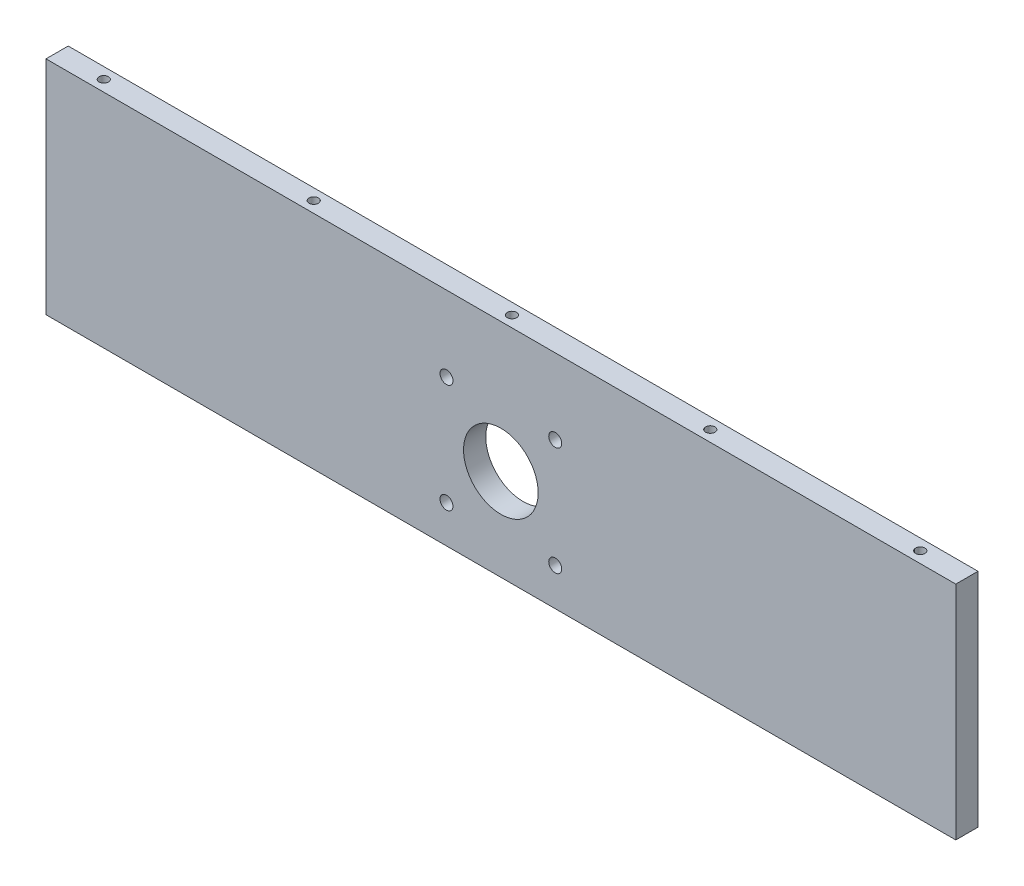
ISO-10303-21;
HEADER;
FILE_DESCRIPTION(('STEP AP214'),'2;1');
FILE_NAME('part.step','',(''),(''),'','','');
FILE_SCHEMA(('AUTOMOTIVE_DESIGN { 1 0 10303 214 1 1 1 1 }'));
ENDSEC;
DATA;
#1=APPLICATION_CONTEXT('core data for automotive mechanical design processes');
#2=APPLICATION_PROTOCOL_DEFINITION('international standard','automotive_design',2000,#1);
#3=PRODUCT_CONTEXT('',#1,'mechanical');
#4=PRODUCT('Part','Part','',(#3));
#5=PRODUCT_RELATED_PRODUCT_CATEGORY('part','',(#4));
#6=PRODUCT_DEFINITION_FORMATION('','',#4);
#7=PRODUCT_DEFINITION_CONTEXT('part definition',#1,'design');
#8=PRODUCT_DEFINITION('design','',#6,#7);
#9=PRODUCT_DEFINITION_SHAPE('','',#8);
#10=(LENGTH_UNIT() NAMED_UNIT(*) SI_UNIT(.MILLI.,.METRE.));
#11=(NAMED_UNIT(*) PLANE_ANGLE_UNIT() SI_UNIT($,.RADIAN.));
#12=(NAMED_UNIT(*) SI_UNIT($,.STERADIAN.) SOLID_ANGLE_UNIT());
#13=UNCERTAINTY_MEASURE_WITH_UNIT(LENGTH_MEASURE(1.E-05),#10,'distance_accuracy_value','');
#14=(GEOMETRIC_REPRESENTATION_CONTEXT(3) GLOBAL_UNCERTAINTY_ASSIGNED_CONTEXT((#13)) GLOBAL_UNIT_ASSIGNED_CONTEXT((#10,
#11,#12)) REPRESENTATION_CONTEXT('',''));
#15=CARTESIAN_POINT('',(0.,0.,0.));
#16=DIRECTION('',(0.,0.,1.));
#17=DIRECTION('',(1.,0.,0.));
#18=AXIS2_PLACEMENT_3D('',#15,#16,#17);
#19=CARTESIAN_POINT('',(-195.,47.5,9.525));
#20=DIRECTION('',(1.,0.,0.));
#21=DIRECTION('',(0.,0.,-1.));
#22=AXIS2_PLACEMENT_3D('',#19,#20,#21);
#23=PLANE('',#22);
#24=DIRECTION('',(0.,-1.,0.));
#25=VECTOR('',#24,1.);
#26=CARTESIAN_POINT('',(-195.,47.5,0.));
#27=LINE('',#26,#25);
#28=CARTESIAN_POINT('',(-195.,47.5,0.));
#29=VERTEX_POINT('',#28);
#30=CARTESIAN_POINT('',(-195.,-47.5,0.));
#31=VERTEX_POINT('',#30);
#32=EDGE_CURVE('E94',#29,#31,#27,.T.);
#33=ORIENTED_EDGE('',*,*,#32,.T.);
#34=DIRECTION('',(0.,0.,-1.));
#35=VECTOR('',#34,1.);
#36=CARTESIAN_POINT('',(-195.,-47.5,9.525));
#37=LINE('',#36,#35);
#38=CARTESIAN_POINT('',(-195.,-47.5,9.525));
#39=VERTEX_POINT('',#38);
#40=EDGE_CURVE('E11',#39,#31,#37,.T.);
#41=ORIENTED_EDGE('',*,*,#40,.F.);
#42=DIRECTION('',(0.,-1.,0.));
#43=VECTOR('',#42,1.);
#44=CARTESIAN_POINT('',(-195.,47.5,9.525));
#45=LINE('',#44,#43);
#46=CARTESIAN_POINT('',(-195.,47.5,9.525));
#47=VERTEX_POINT('',#46);
#48=EDGE_CURVE('E82',#47,#39,#45,.T.);
#49=ORIENTED_EDGE('',*,*,#48,.F.);
#50=DIRECTION('',(0.,0.,-1.));
#51=VECTOR('',#50,1.);
#52=CARTESIAN_POINT('',(-195.,47.5,9.525));
#53=LINE('',#52,#51);
#54=EDGE_CURVE('E90',#47,#29,#53,.T.);
#55=ORIENTED_EDGE('',*,*,#54,.T.);
#56=EDGE_LOOP('',(#33,#41,#49,#55));
#57=FACE_BOUND('',#56,.T.);
#58=ADVANCED_FACE('F31',(#57),#23,.F.);
#59=CARTESIAN_POINT('',(-195.,-47.5,9.525));
#60=DIRECTION('',(0.,1.,0.));
#61=DIRECTION('',(0.,0.,1.));
#62=AXIS2_PLACEMENT_3D('',#59,#60,#61);
#63=PLANE('',#62);
#64=CARTESIAN_POINT('',(115.,-47.5,4.7625));
#65=DIRECTION('',(0.,-1.,0.));
#66=DIRECTION('',(0.,0.,-1.));
#67=AXIS2_PLACEMENT_3D('',#64,#65,#66);
#68=CIRCLE('',#67,2.);
#69=CARTESIAN_POINT('',(115.,-47.5,2.76250000000001));
#70=VERTEX_POINT('',#69);
#71=EDGE_CURVE('E180',#70,#70,#68,.T.);
#72=ORIENTED_EDGE('',*,*,#71,.F.);
#73=EDGE_LOOP('',(#72));
#74=FACE_BOUND('',#73,.T.);
#75=CARTESIAN_POINT('',(0.,-47.5,4.7625));
#76=DIRECTION('',(0.,-1.,0.));
#77=DIRECTION('',(0.,0.,-1.));
#78=AXIS2_PLACEMENT_3D('',#75,#76,#77);
#79=CIRCLE('',#78,2.);
#80=CARTESIAN_POINT('',(0.,-47.5,2.7625));
#81=VERTEX_POINT('',#80);
#82=EDGE_CURVE('E174',#81,#81,#79,.T.);
#83=ORIENTED_EDGE('',*,*,#82,.F.);
#84=EDGE_LOOP('',(#83));
#85=FACE_BOUND('',#84,.T.);
#86=CARTESIAN_POINT('',(-115.,-47.5,4.7625));
#87=DIRECTION('',(0.,-1.,0.));
#88=DIRECTION('',(0.,0.,-1.));
#89=AXIS2_PLACEMENT_3D('',#86,#87,#88);
#90=CIRCLE('',#89,2.);
#91=CARTESIAN_POINT('',(-115.,-47.5,2.76250000000001));
#92=VERTEX_POINT('',#91);
#93=EDGE_CURVE('E168',#92,#92,#90,.T.);
#94=ORIENTED_EDGE('',*,*,#93,.F.);
#95=EDGE_LOOP('',(#94));
#96=FACE_BOUND('',#95,.T.);
#97=DIRECTION('',(1.,0.,0.));
#98=VECTOR('',#97,1.);
#99=CARTESIAN_POINT('',(-195.,-47.5,0.));
#100=LINE('',#99,#98);
#101=CARTESIAN_POINT('',(195.,-47.5,0.));
#102=VERTEX_POINT('',#101);
#103=EDGE_CURVE('E86',#31,#102,#100,.T.);
#104=ORIENTED_EDGE('',*,*,#103,.T.);
#105=DIRECTION('',(0.,0.,-1.));
#106=VECTOR('',#105,1.);
#107=CARTESIAN_POINT('',(195.,-47.5,9.525));
#108=LINE('',#107,#106);
#109=CARTESIAN_POINT('',(195.,-47.5,9.525));
#110=VERTEX_POINT('',#109);
#111=EDGE_CURVE('E39',#110,#102,#108,.T.);
#112=ORIENTED_EDGE('',*,*,#111,.F.);
#113=DIRECTION('',(1.,0.,0.));
#114=VECTOR('',#113,1.);
#115=CARTESIAN_POINT('',(-195.,-47.5,9.525));
#116=LINE('',#115,#114);
#117=EDGE_CURVE('E77',#39,#110,#116,.T.);
#118=ORIENTED_EDGE('',*,*,#117,.F.);
#119=ORIENTED_EDGE('',*,*,#40,.T.);
#120=EDGE_LOOP('',(#104,#112,#118,#119));
#121=FACE_BOUND('',#120,.T.);
#122=ADVANCED_FACE('F85',(#74,#85,#96,#121),#63,.F.);
#123=CARTESIAN_POINT('',(195.,47.5,9.525));
#124=DIRECTION('',(-1.,0.,0.));
#125=DIRECTION('',(0.,0.,1.));
#126=AXIS2_PLACEMENT_3D('',#123,#124,#125);
#127=PLANE('',#126);
#128=DIRECTION('',(0.,1.,0.));
#129=VECTOR('',#128,1.);
#130=CARTESIAN_POINT('',(195.,47.5,0.));
#131=LINE('',#130,#129);
#132=CARTESIAN_POINT('',(195.,47.5,0.));
#133=VERTEX_POINT('',#132);
#134=EDGE_CURVE('E64',#102,#133,#131,.T.);
#135=ORIENTED_EDGE('',*,*,#134,.T.);
#136=DIRECTION('',(0.,0.,-1.));
#137=VECTOR('',#136,1.);
#138=CARTESIAN_POINT('',(195.,47.5,9.525));
#139=LINE('',#138,#137);
#140=CARTESIAN_POINT('',(195.,47.5,9.525));
#141=VERTEX_POINT('',#140);
#142=EDGE_CURVE('E87',#141,#133,#139,.T.);
#143=ORIENTED_EDGE('',*,*,#142,.F.);
#144=DIRECTION('',(0.,1.,0.));
#145=VECTOR('',#144,1.);
#146=CARTESIAN_POINT('',(195.,47.5,9.525));
#147=LINE('',#146,#145);
#148=EDGE_CURVE('E80',#110,#141,#147,.T.);
#149=ORIENTED_EDGE('',*,*,#148,.F.);
#150=ORIENTED_EDGE('',*,*,#111,.T.);
#151=EDGE_LOOP('',(#135,#143,#149,#150));
#152=FACE_BOUND('',#151,.T.);
#153=ADVANCED_FACE('F88',(#152),#127,.F.);
#154=CARTESIAN_POINT('',(-195.,47.5,9.525));
#155=DIRECTION('',(0.,-1.,0.));
#156=DIRECTION('',(0.,0.,-1.));
#157=AXIS2_PLACEMENT_3D('',#154,#155,#156);
#158=PLANE('',#157);
#159=CARTESIAN_POINT('',(-85.,47.5,4.76249999999996));
#160=DIRECTION('',(0.,1.,0.));
#161=DIRECTION('',(0.,0.,-1.));
#162=AXIS2_PLACEMENT_3D('',#159,#160,#161);
#163=CIRCLE('',#162,2.);
#164=CARTESIAN_POINT('',(-85.,47.5,2.76249999999997));
#165=VERTEX_POINT('',#164);
#166=EDGE_CURVE('E162',#165,#165,#163,.T.);
#167=ORIENTED_EDGE('',*,*,#166,.F.);
#168=EDGE_LOOP('',(#167));
#169=FACE_BOUND('',#168,.T.);
#170=CARTESIAN_POINT('',(-175.,47.5,4.76249999999995));
#171=DIRECTION('',(0.,1.,0.));
#172=DIRECTION('',(0.,0.,-1.));
#173=AXIS2_PLACEMENT_3D('',#170,#171,#172);
#174=CIRCLE('',#173,2.);
#175=CARTESIAN_POINT('',(-175.,47.5,2.76249999999996));
#176=VERTEX_POINT('',#175);
#177=EDGE_CURVE('E156',#176,#176,#174,.T.);
#178=ORIENTED_EDGE('',*,*,#177,.F.);
#179=EDGE_LOOP('',(#178));
#180=FACE_BOUND('',#179,.T.);
#181=CARTESIAN_POINT('',(0.,47.5,4.7625));
#182=DIRECTION('',(0.,1.,0.));
#183=DIRECTION('',(0.,0.,1.));
#184=AXIS2_PLACEMENT_3D('',#181,#182,#183);
#185=CIRCLE('',#184,2.);
#186=CARTESIAN_POINT('',(0.,47.5,6.7625));
#187=VERTEX_POINT('',#186);
#188=EDGE_CURVE('E150',#187,#187,#185,.T.);
#189=ORIENTED_EDGE('',*,*,#188,.F.);
#190=EDGE_LOOP('',(#189));
#191=FACE_BOUND('',#190,.T.);
#192=CARTESIAN_POINT('',(85.,47.5,4.76249999999997));
#193=DIRECTION('',(0.,1.,0.));
#194=DIRECTION('',(0.,0.,1.));
#195=AXIS2_PLACEMENT_3D('',#192,#193,#194);
#196=CIRCLE('',#195,2.);
#197=CARTESIAN_POINT('',(85.,47.5,6.76249999999996));
#198=VERTEX_POINT('',#197);
#199=EDGE_CURVE('E144',#198,#198,#196,.T.);
#200=ORIENTED_EDGE('',*,*,#199,.F.);
#201=EDGE_LOOP('',(#200));
#202=FACE_BOUND('',#201,.T.);
#203=CARTESIAN_POINT('',(175.,47.5,4.76249999999995));
#204=DIRECTION('',(0.,1.,0.));
#205=DIRECTION('',(0.,0.,1.));
#206=AXIS2_PLACEMENT_3D('',#203,#204,#205);
#207=CIRCLE('',#206,2.);
#208=CARTESIAN_POINT('',(175.,47.5,6.76249999999995));
#209=VERTEX_POINT('',#208);
#210=EDGE_CURVE('E138',#209,#209,#207,.T.);
#211=ORIENTED_EDGE('',*,*,#210,.F.);
#212=EDGE_LOOP('',(#211));
#213=FACE_BOUND('',#212,.T.);
#214=DIRECTION('',(-1.,0.,0.));
#215=VECTOR('',#214,1.);
#216=CARTESIAN_POINT('',(-195.,47.5,0.));
#217=LINE('',#216,#215);
#218=EDGE_CURVE('E70',#133,#29,#217,.T.);
#219=ORIENTED_EDGE('',*,*,#218,.T.);
#220=ORIENTED_EDGE('',*,*,#54,.F.);
#221=DIRECTION('',(-1.,0.,0.));
#222=VECTOR('',#221,1.);
#223=CARTESIAN_POINT('',(-195.,47.5,9.525));
#224=LINE('',#223,#222);
#225=EDGE_CURVE('E47',#141,#47,#224,.T.);
#226=ORIENTED_EDGE('',*,*,#225,.F.);
#227=ORIENTED_EDGE('',*,*,#142,.T.);
#228=EDGE_LOOP('',(#219,#220,#226,#227));
#229=FACE_BOUND('',#228,.T.);
#230=ADVANCED_FACE('F102',(#169,#180,#191,#202,#213,#229),#158,.F.);
#231=CARTESIAN_POINT('',(-195.,-47.5,9.525));
#232=DIRECTION('',(0.,0.,1.));
#233=DIRECTION('',(1.,0.,0.));
#234=AXIS2_PLACEMENT_3D('',#231,#232,#233);
#235=PLANE('',#234);
#236=CARTESIAN_POINT('',(23.2880289614161,15.18,9.525));
#237=DIRECTION('',(0.,0.,1.));
#238=DIRECTION('',(1.,0.,0.));
#239=AXIS2_PLACEMENT_3D('',#236,#237,#238);
#240=CIRCLE('',#239,2.78);
#241=CARTESIAN_POINT('',(20.5080289614161,15.18,9.525));
#242=VERTEX_POINT('',#241);
#243=EDGE_CURVE('E131',#242,#242,#240,.F.);
#244=ORIENTED_EDGE('',*,*,#243,.T.);
#245=EDGE_LOOP('',(#244));
#246=FACE_BOUND('',#245,.T.);
#247=CARTESIAN_POINT('',(-23.3119710385839,15.18,9.525));
#248=DIRECTION('',(0.,0.,1.));
#249=DIRECTION('',(1.,0.,0.));
#250=AXIS2_PLACEMENT_3D('',#247,#248,#249);
#251=CIRCLE('',#250,2.78);
#252=CARTESIAN_POINT('',(-26.0919710385839,15.18,9.525));
#253=VERTEX_POINT('',#252);
#254=EDGE_CURVE('E125',#253,#253,#251,.F.);
#255=ORIENTED_EDGE('',*,*,#254,.T.);
#256=EDGE_LOOP('',(#255));
#257=FACE_BOUND('',#256,.T.);
#258=CARTESIAN_POINT('',(23.2880289614161,-31.42,9.525));
#259=DIRECTION('',(0.,0.,1.));
#260=DIRECTION('',(1.,0.,0.));
#261=AXIS2_PLACEMENT_3D('',#258,#259,#260);
#262=CIRCLE('',#261,2.78);
#263=CARTESIAN_POINT('',(20.5080289614161,-31.42,9.525));
#264=VERTEX_POINT('',#263);
#265=EDGE_CURVE('E119',#264,#264,#262,.F.);
#266=ORIENTED_EDGE('',*,*,#265,.T.);
#267=EDGE_LOOP('',(#266));
#268=FACE_BOUND('',#267,.T.);
#269=CARTESIAN_POINT('',(-23.3119710385839,-31.42,9.525));
#270=DIRECTION('',(0.,0.,1.));
#271=DIRECTION('',(1.,0.,0.));
#272=AXIS2_PLACEMENT_3D('',#269,#270,#271);
#273=CIRCLE('',#272,2.78);
#274=CARTESIAN_POINT('',(-26.0919710385839,-31.42,9.525));
#275=VERTEX_POINT('',#274);
#276=EDGE_CURVE('E113',#275,#275,#273,.F.);
#277=ORIENTED_EDGE('',*,*,#276,.T.);
#278=EDGE_LOOP('',(#277));
#279=FACE_BOUND('',#278,.T.);
#280=CARTESIAN_POINT('',(-0.0119710385839134,-8.11999999999999,9.525));
#281=DIRECTION('',(0.,0.,1.));
#282=DIRECTION('',(1.,0.,0.));
#283=AXIS2_PLACEMENT_3D('',#280,#281,#282);
#284=CIRCLE('',#283,16.);
#285=CARTESIAN_POINT('',(15.9880289614161,-8.11999999999999,9.525));
#286=VERTEX_POINT('',#285);
#287=EDGE_CURVE('E110',#286,#286,#284,.T.);
#288=ORIENTED_EDGE('',*,*,#287,.F.);
#289=EDGE_LOOP('',(#288));
#290=FACE_BOUND('',#289,.T.);
#291=ORIENTED_EDGE('',*,*,#48,.T.);
#292=ORIENTED_EDGE('',*,*,#117,.T.);
#293=ORIENTED_EDGE('',*,*,#148,.T.);
#294=ORIENTED_EDGE('',*,*,#225,.T.);
#295=EDGE_LOOP('',(#291,#292,#293,#294));
#296=FACE_BOUND('',#295,.T.);
#297=ADVANCED_FACE('F78',(#246,#257,#268,#279,#290,#296),#235,.T.);
#298=CARTESIAN_POINT('',(-195.,-47.5,0.));
#299=DIRECTION('',(0.,0.,1.));
#300=DIRECTION('',(1.,0.,0.));
#301=AXIS2_PLACEMENT_3D('',#298,#299,#300);
#302=PLANE('',#301);
#303=CARTESIAN_POINT('',(23.2880289614161,15.18,0.));
#304=DIRECTION('',(0.,0.,-1.));
#305=DIRECTION('',(1.,0.,0.));
#306=AXIS2_PLACEMENT_3D('',#303,#304,#305);
#307=CIRCLE('',#306,2.78);
#308=CARTESIAN_POINT('',(20.5080289614161,15.18,0.));
#309=VERTEX_POINT('',#308);
#310=EDGE_CURVE('E134',#309,#309,#307,.T.);
#311=ORIENTED_EDGE('',*,*,#310,.F.);
#312=EDGE_LOOP('',(#311));
#313=FACE_BOUND('',#312,.T.);
#314=CARTESIAN_POINT('',(-23.3119710385839,15.18,0.));
#315=DIRECTION('',(0.,0.,-1.));
#316=DIRECTION('',(-1.,0.,0.));
#317=AXIS2_PLACEMENT_3D('',#314,#315,#316);
#318=CIRCLE('',#317,2.78);
#319=CARTESIAN_POINT('',(-26.0919710385839,15.18,0.));
#320=VERTEX_POINT('',#319);
#321=EDGE_CURVE('E128',#320,#320,#318,.T.);
#322=ORIENTED_EDGE('',*,*,#321,.F.);
#323=EDGE_LOOP('',(#322));
#324=FACE_BOUND('',#323,.T.);
#325=CARTESIAN_POINT('',(23.2880289614161,-31.42,0.));
#326=DIRECTION('',(0.,0.,-1.));
#327=DIRECTION('',(-1.,0.,0.));
#328=AXIS2_PLACEMENT_3D('',#325,#326,#327);
#329=CIRCLE('',#328,2.78);
#330=CARTESIAN_POINT('',(20.5080289614161,-31.42,0.));
#331=VERTEX_POINT('',#330);
#332=EDGE_CURVE('E122',#331,#331,#329,.T.);
#333=ORIENTED_EDGE('',*,*,#332,.F.);
#334=EDGE_LOOP('',(#333));
#335=FACE_BOUND('',#334,.T.);
#336=CARTESIAN_POINT('',(-23.3119710385839,-31.42,0.));
#337=DIRECTION('',(0.,0.,-1.));
#338=DIRECTION('',(1.,0.,0.));
#339=AXIS2_PLACEMENT_3D('',#336,#337,#338);
#340=CIRCLE('',#339,2.78);
#341=CARTESIAN_POINT('',(-26.0919710385839,-31.42,0.));
#342=VERTEX_POINT('',#341);
#343=EDGE_CURVE('E116',#342,#342,#340,.T.);
#344=ORIENTED_EDGE('',*,*,#343,.F.);
#345=EDGE_LOOP('',(#344));
#346=FACE_BOUND('',#345,.T.);
#347=CARTESIAN_POINT('',(-0.0119710385839134,-8.11999999999999,0.));
#348=DIRECTION('',(0.,0.,1.));
#349=DIRECTION('',(1.,0.,0.));
#350=AXIS2_PLACEMENT_3D('',#347,#348,#349);
#351=CIRCLE('',#350,16.);
#352=CARTESIAN_POINT('',(15.9880289614161,-8.11999999999999,0.));
#353=VERTEX_POINT('',#352);
#354=EDGE_CURVE('E97',#353,#353,#351,.F.);
#355=ORIENTED_EDGE('',*,*,#354,.F.);
#356=EDGE_LOOP('',(#355));
#357=FACE_BOUND('',#356,.T.);
#358=ORIENTED_EDGE('',*,*,#32,.F.);
#359=ORIENTED_EDGE('',*,*,#218,.F.);
#360=ORIENTED_EDGE('',*,*,#134,.F.);
#361=ORIENTED_EDGE('',*,*,#103,.F.);
#362=EDGE_LOOP('',(#358,#359,#360,#361));
#363=FACE_BOUND('',#362,.T.);
#364=ADVANCED_FACE('F105',(#313,#324,#335,#346,#357,#363),#302,.F.);
#365=CARTESIAN_POINT('',(-0.0119710385839134,-8.11999999999999,-45.254833995939));
#366=DIRECTION('',(0.,0.,1.));
#367=DIRECTION('',(1.,0.,0.));
#368=AXIS2_PLACEMENT_3D('',#365,#366,#367);
#369=CYLINDRICAL_SURFACE('',#368,16.);
#370=ORIENTED_EDGE('',*,*,#354,.T.);
#371=EDGE_LOOP('',(#370));
#372=FACE_BOUND('',#371,.T.);
#373=ORIENTED_EDGE('',*,*,#287,.T.);
#374=EDGE_LOOP('',(#373));
#375=FACE_BOUND('',#374,.T.);
#376=ADVANCED_FACE('F259',(#372,#375),#369,.F.);
#377=CARTESIAN_POINT('',(-23.3119710385839,-31.42,17.3880274067944));
#378=DIRECTION('',(0.,0.,-1.));
#379=DIRECTION('',(-1.,0.,0.));
#380=AXIS2_PLACEMENT_3D('',#377,#378,#379);
#381=CYLINDRICAL_SURFACE('',#380,2.78);
#382=CARTESIAN_POINT('',(-26.0919710385839,-31.42,0.));
#383=CARTESIAN_POINT('',(-26.0919710385839,-31.42,0.0992187500000001));
#384=CARTESIAN_POINT('',(-26.0919710385839,-31.42,0.1984375));
#385=CARTESIAN_POINT('',(-26.0919710385839,-31.42,0.396875));
#386=CARTESIAN_POINT('',(-26.0919710385839,-31.42,0.49609375));
#387=CARTESIAN_POINT('',(-26.0919710385839,-31.42,0.69453125));
#388=CARTESIAN_POINT('',(-26.0919710385839,-31.42,0.79375));
#389=CARTESIAN_POINT('',(-26.0919710385839,-31.42,0.992187500000001));
#390=CARTESIAN_POINT('',(-26.0919710385839,-31.42,1.09140625));
#391=CARTESIAN_POINT('',(-26.0919710385839,-31.42,1.28984375));
#392=CARTESIAN_POINT('',(-26.0919710385839,-31.42,1.3890625));
#393=CARTESIAN_POINT('',(-26.0919710385839,-31.42,1.5875));
#394=CARTESIAN_POINT('',(-26.0919710385839,-31.42,1.68671875));
#395=CARTESIAN_POINT('',(-26.0919710385839,-31.42,1.88515625));
#396=CARTESIAN_POINT('',(-26.0919710385839,-31.42,1.984375));
#397=CARTESIAN_POINT('',(-26.0919710385839,-31.42,2.1828125));
#398=CARTESIAN_POINT('',(-26.0919710385839,-31.42,2.28203125));
#399=CARTESIAN_POINT('',(-26.0919710385839,-31.42,2.48046875));
#400=CARTESIAN_POINT('',(-26.0919710385839,-31.42,2.5796875));
#401=CARTESIAN_POINT('',(-26.0919710385839,-31.42,2.778125));
#402=CARTESIAN_POINT('',(-26.0919710385839,-31.42,2.87734375));
#403=CARTESIAN_POINT('',(-26.0919710385839,-31.42,3.07578125));
#404=CARTESIAN_POINT('',(-26.0919710385839,-31.42,3.175));
#405=CARTESIAN_POINT('',(-26.0919710385839,-31.42,3.3734375));
#406=CARTESIAN_POINT('',(-26.0919710385839,-31.42,3.47265625));
#407=CARTESIAN_POINT('',(-26.0919710385839,-31.42,3.67109375));
#408=CARTESIAN_POINT('',(-26.0919710385839,-31.42,3.7703125));
#409=CARTESIAN_POINT('',(-26.0919710385839,-31.42,3.96875));
#410=CARTESIAN_POINT('',(-26.0919710385839,-31.42,4.06796875));
#411=CARTESIAN_POINT('',(-26.0919710385839,-31.42,4.26640625));
#412=CARTESIAN_POINT('',(-26.0919710385839,-31.42,4.365625));
#413=CARTESIAN_POINT('',(-26.0919710385839,-31.42,4.5640625));
#414=CARTESIAN_POINT('',(-26.0919710385839,-31.42,4.66328125));
#415=CARTESIAN_POINT('',(-26.0919710385839,-31.42,4.86171875));
#416=CARTESIAN_POINT('',(-26.0919710385839,-31.42,4.9609375));
#417=CARTESIAN_POINT('',(-26.0919710385839,-31.42,5.159375));
#418=CARTESIAN_POINT('',(-26.0919710385839,-31.42,5.25859375));
#419=CARTESIAN_POINT('',(-26.0919710385839,-31.42,5.45703125));
#420=CARTESIAN_POINT('',(-26.0919710385839,-31.42,5.55625));
#421=CARTESIAN_POINT('',(-26.0919710385839,-31.42,5.7546875));
#422=CARTESIAN_POINT('',(-26.0919710385839,-31.42,5.85390625));
#423=CARTESIAN_POINT('',(-26.0919710385839,-31.42,6.05234375));
#424=CARTESIAN_POINT('',(-26.0919710385839,-31.42,6.1515625));
#425=CARTESIAN_POINT('',(-26.0919710385839,-31.42,6.35));
#426=CARTESIAN_POINT('',(-26.0919710385839,-31.42,6.44921875));
#427=CARTESIAN_POINT('',(-26.0919710385839,-31.42,6.64765625));
#428=CARTESIAN_POINT('',(-26.0919710385839,-31.42,6.746875));
#429=CARTESIAN_POINT('',(-26.0919710385839,-31.42,6.9453125));
#430=CARTESIAN_POINT('',(-26.0919710385839,-31.42,7.04453125));
#431=CARTESIAN_POINT('',(-26.0919710385839,-31.42,7.24296875));
#432=CARTESIAN_POINT('',(-26.0919710385839,-31.42,7.3421875));
#433=CARTESIAN_POINT('',(-26.0919710385839,-31.42,7.540625));
#434=CARTESIAN_POINT('',(-26.0919710385839,-31.42,7.63984375));
#435=CARTESIAN_POINT('',(-26.0919710385839,-31.42,7.83828125));
#436=CARTESIAN_POINT('',(-26.0919710385839,-31.42,7.9375));
#437=CARTESIAN_POINT('',(-26.0919710385839,-31.42,8.1359375));
#438=CARTESIAN_POINT('',(-26.0919710385839,-31.42,8.23515625));
#439=CARTESIAN_POINT('',(-26.0919710385839,-31.42,8.43359375));
#440=CARTESIAN_POINT('',(-26.0919710385839,-31.42,8.5328125));
#441=CARTESIAN_POINT('',(-26.0919710385839,-31.42,8.73125));
#442=CARTESIAN_POINT('',(-26.0919710385839,-31.42,8.83046875));
#443=CARTESIAN_POINT('',(-26.0919710385839,-31.42,9.02890625));
#444=CARTESIAN_POINT('',(-26.0919710385839,-31.42,9.128125));
#445=CARTESIAN_POINT('',(-26.0919710385839,-31.42,9.3265625));
#446=CARTESIAN_POINT('',(-26.0919710385839,-31.42,9.42578125));
#447=CARTESIAN_POINT('',(-26.0919710385839,-31.42,9.525));
#448=B_SPLINE_CURVE_WITH_KNOTS('',3,(#382,#383,#384,#385,#386,#387,#388,#389,#390,#391,#392,
#393,#394,#395,#396,#397,#398,#399,#400,#401,#402,#403,#404,#405,#406,#407,#408,#409,#410,#411,
#412,#413,#414,#415,#416,#417,#418,#419,#420,#421,#422,#423,#424,#425,#426,#427,#428,#429,#430,
#431,#432,#433,#434,#435,#436,#437,#438,#439,#440,#441,#442,#443,#444,#445,#446,#447),
.UNSPECIFIED.,.F.,.F.,(4,2,2,2,2,2,2,2,2,2,2,2,2,2,2,2,2,2,2,2,2,2,2,2,2,2,2,2,2,2,2,2,4),(0.,
0.29765625,0.5953125,0.892968750000001,1.190625,1.48828125,1.7859375,2.08359375,2.38125,
2.67890625,2.9765625,3.27421875,3.571875,3.86953125,4.1671875,4.46484375,4.7625,5.06015625,
5.3578125,5.65546875,5.953125,6.25078125,6.5484375,6.84609375,7.14375,7.44140625,7.7390625,
8.03671875,8.334375,8.63203125,8.9296875,9.22734375,9.525),.UNSPECIFIED.);
#449=EDGE_CURVE('BSEAM267',#342,#275,#448,.T.);
#450=ORIENTED_EDGE('',*,*,#343,.T.);
#451=ORIENTED_EDGE('',*,*,#276,.F.);
#452=ORIENTED_EDGE('',*,*,#449,.T.);
#453=ORIENTED_EDGE('',*,*,#449,.F.);
#454=EDGE_LOOP('',(#450,#452,#451,#453));
#455=FACE_BOUND('',#454,.T.);
#456=ADVANCED_FACE('F267',(#455),#381,.F.);
#457=CARTESIAN_POINT('',(23.2880289614161,-31.42,17.3880274067944));
#458=DIRECTION('',(0.,0.,-1.));
#459=DIRECTION('',(-1.,0.,0.));
#460=AXIS2_PLACEMENT_3D('',#457,#458,#459);
#461=CYLINDRICAL_SURFACE('',#460,2.78);
#462=CARTESIAN_POINT('',(20.5080289614161,-31.42,0.));
#463=CARTESIAN_POINT('',(20.5080289614161,-31.42,0.0992187500000001));
#464=CARTESIAN_POINT('',(20.5080289614161,-31.42,0.1984375));
#465=CARTESIAN_POINT('',(20.5080289614161,-31.42,0.396875));
#466=CARTESIAN_POINT('',(20.5080289614161,-31.42,0.49609375));
#467=CARTESIAN_POINT('',(20.5080289614161,-31.42,0.69453125));
#468=CARTESIAN_POINT('',(20.5080289614161,-31.42,0.79375));
#469=CARTESIAN_POINT('',(20.5080289614161,-31.42,0.992187500000001));
#470=CARTESIAN_POINT('',(20.5080289614161,-31.42,1.09140625));
#471=CARTESIAN_POINT('',(20.5080289614161,-31.42,1.28984375));
#472=CARTESIAN_POINT('',(20.5080289614161,-31.42,1.3890625));
#473=CARTESIAN_POINT('',(20.5080289614161,-31.42,1.5875));
#474=CARTESIAN_POINT('',(20.5080289614161,-31.42,1.68671875));
#475=CARTESIAN_POINT('',(20.5080289614161,-31.42,1.88515625));
#476=CARTESIAN_POINT('',(20.5080289614161,-31.42,1.984375));
#477=CARTESIAN_POINT('',(20.5080289614161,-31.42,2.1828125));
#478=CARTESIAN_POINT('',(20.5080289614161,-31.42,2.28203125));
#479=CARTESIAN_POINT('',(20.5080289614161,-31.42,2.48046875));
#480=CARTESIAN_POINT('',(20.5080289614161,-31.42,2.5796875));
#481=CARTESIAN_POINT('',(20.5080289614161,-31.42,2.778125));
#482=CARTESIAN_POINT('',(20.5080289614161,-31.42,2.87734375));
#483=CARTESIAN_POINT('',(20.5080289614161,-31.42,3.07578125));
#484=CARTESIAN_POINT('',(20.5080289614161,-31.42,3.175));
#485=CARTESIAN_POINT('',(20.5080289614161,-31.42,3.3734375));
#486=CARTESIAN_POINT('',(20.5080289614161,-31.42,3.47265625));
#487=CARTESIAN_POINT('',(20.5080289614161,-31.42,3.67109375));
#488=CARTESIAN_POINT('',(20.5080289614161,-31.42,3.7703125));
#489=CARTESIAN_POINT('',(20.5080289614161,-31.42,3.96875));
#490=CARTESIAN_POINT('',(20.5080289614161,-31.42,4.06796875));
#491=CARTESIAN_POINT('',(20.5080289614161,-31.42,4.26640625));
#492=CARTESIAN_POINT('',(20.5080289614161,-31.42,4.365625));
#493=CARTESIAN_POINT('',(20.5080289614161,-31.42,4.5640625));
#494=CARTESIAN_POINT('',(20.5080289614161,-31.42,4.66328125));
#495=CARTESIAN_POINT('',(20.5080289614161,-31.42,4.86171875));
#496=CARTESIAN_POINT('',(20.5080289614161,-31.42,4.9609375));
#497=CARTESIAN_POINT('',(20.5080289614161,-31.42,5.159375));
#498=CARTESIAN_POINT('',(20.5080289614161,-31.42,5.25859375));
#499=CARTESIAN_POINT('',(20.5080289614161,-31.42,5.45703125));
#500=CARTESIAN_POINT('',(20.5080289614161,-31.42,5.55625));
#501=CARTESIAN_POINT('',(20.5080289614161,-31.42,5.7546875));
#502=CARTESIAN_POINT('',(20.5080289614161,-31.42,5.85390625));
#503=CARTESIAN_POINT('',(20.5080289614161,-31.42,6.05234375));
#504=CARTESIAN_POINT('',(20.5080289614161,-31.42,6.1515625));
#505=CARTESIAN_POINT('',(20.5080289614161,-31.42,6.35));
#506=CARTESIAN_POINT('',(20.5080289614161,-31.42,6.44921875));
#507=CARTESIAN_POINT('',(20.5080289614161,-31.42,6.64765625));
#508=CARTESIAN_POINT('',(20.5080289614161,-31.42,6.746875));
#509=CARTESIAN_POINT('',(20.5080289614161,-31.42,6.9453125));
#510=CARTESIAN_POINT('',(20.5080289614161,-31.42,7.04453125));
#511=CARTESIAN_POINT('',(20.5080289614161,-31.42,7.24296875));
#512=CARTESIAN_POINT('',(20.5080289614161,-31.42,7.3421875));
#513=CARTESIAN_POINT('',(20.5080289614161,-31.42,7.540625));
#514=CARTESIAN_POINT('',(20.5080289614161,-31.42,7.63984375));
#515=CARTESIAN_POINT('',(20.5080289614161,-31.42,7.83828125));
#516=CARTESIAN_POINT('',(20.5080289614161,-31.42,7.9375));
#517=CARTESIAN_POINT('',(20.5080289614161,-31.42,8.1359375));
#518=CARTESIAN_POINT('',(20.5080289614161,-31.42,8.23515625));
#519=CARTESIAN_POINT('',(20.5080289614161,-31.42,8.43359375));
#520=CARTESIAN_POINT('',(20.5080289614161,-31.42,8.5328125));
#521=CARTESIAN_POINT('',(20.5080289614161,-31.42,8.73125));
#522=CARTESIAN_POINT('',(20.5080289614161,-31.42,8.83046875));
#523=CARTESIAN_POINT('',(20.5080289614161,-31.42,9.02890625));
#524=CARTESIAN_POINT('',(20.5080289614161,-31.42,9.128125));
#525=CARTESIAN_POINT('',(20.5080289614161,-31.42,9.3265625));
#526=CARTESIAN_POINT('',(20.5080289614161,-31.42,9.42578125));
#527=CARTESIAN_POINT('',(20.5080289614161,-31.42,9.525));
#528=B_SPLINE_CURVE_WITH_KNOTS('',3,(#462,#463,#464,#465,#466,#467,#468,#469,#470,#471,#472,
#473,#474,#475,#476,#477,#478,#479,#480,#481,#482,#483,#484,#485,#486,#487,#488,#489,#490,#491,
#492,#493,#494,#495,#496,#497,#498,#499,#500,#501,#502,#503,#504,#505,#506,#507,#508,#509,#510,
#511,#512,#513,#514,#515,#516,#517,#518,#519,#520,#521,#522,#523,#524,#525,#526,#527),
.UNSPECIFIED.,.F.,.F.,(4,2,2,2,2,2,2,2,2,2,2,2,2,2,2,2,2,2,2,2,2,2,2,2,2,2,2,2,2,2,2,2,4),(0.,
0.29765625,0.5953125,0.892968750000001,1.190625,1.48828125,1.7859375,2.08359375,2.38125,
2.67890625,2.9765625,3.27421875,3.571875,3.86953125,4.1671875,4.46484375,4.7625,5.06015625,
5.3578125,5.65546875,5.953125,6.25078125,6.5484375,6.84609375,7.14375,7.44140625,7.7390625,
8.03671875,8.334375,8.63203125,8.9296875,9.22734375,9.525),.UNSPECIFIED.);
#529=EDGE_CURVE('BSEAM274',#331,#264,#528,.T.);
#530=ORIENTED_EDGE('',*,*,#332,.T.);
#531=ORIENTED_EDGE('',*,*,#265,.F.);
#532=ORIENTED_EDGE('',*,*,#529,.T.);
#533=ORIENTED_EDGE('',*,*,#529,.F.);
#534=EDGE_LOOP('',(#530,#532,#531,#533));
#535=FACE_BOUND('',#534,.T.);
#536=ADVANCED_FACE('F274',(#535),#461,.F.);
#537=CARTESIAN_POINT('',(-23.3119710385839,15.18,17.3880274067944));
#538=DIRECTION('',(0.,0.,-1.));
#539=DIRECTION('',(-1.,0.,0.));
#540=AXIS2_PLACEMENT_3D('',#537,#538,#539);
#541=CYLINDRICAL_SURFACE('',#540,2.78);
#542=CARTESIAN_POINT('',(-26.0919710385839,15.18,0.));
#543=CARTESIAN_POINT('',(-26.0919710385839,15.18,0.0992187500000001));
#544=CARTESIAN_POINT('',(-26.0919710385839,15.18,0.1984375));
#545=CARTESIAN_POINT('',(-26.0919710385839,15.18,0.396875));
#546=CARTESIAN_POINT('',(-26.0919710385839,15.18,0.49609375));
#547=CARTESIAN_POINT('',(-26.0919710385839,15.18,0.69453125));
#548=CARTESIAN_POINT('',(-26.0919710385839,15.18,0.79375));
#549=CARTESIAN_POINT('',(-26.0919710385839,15.18,0.992187500000001));
#550=CARTESIAN_POINT('',(-26.0919710385839,15.18,1.09140625));
#551=CARTESIAN_POINT('',(-26.0919710385839,15.18,1.28984375));
#552=CARTESIAN_POINT('',(-26.0919710385839,15.18,1.3890625));
#553=CARTESIAN_POINT('',(-26.0919710385839,15.18,1.5875));
#554=CARTESIAN_POINT('',(-26.0919710385839,15.18,1.68671875));
#555=CARTESIAN_POINT('',(-26.0919710385839,15.18,1.88515625));
#556=CARTESIAN_POINT('',(-26.0919710385839,15.18,1.984375));
#557=CARTESIAN_POINT('',(-26.0919710385839,15.18,2.1828125));
#558=CARTESIAN_POINT('',(-26.0919710385839,15.18,2.28203125));
#559=CARTESIAN_POINT('',(-26.0919710385839,15.18,2.48046875));
#560=CARTESIAN_POINT('',(-26.0919710385839,15.18,2.5796875));
#561=CARTESIAN_POINT('',(-26.0919710385839,15.18,2.778125));
#562=CARTESIAN_POINT('',(-26.0919710385839,15.18,2.87734375));
#563=CARTESIAN_POINT('',(-26.0919710385839,15.18,3.07578125));
#564=CARTESIAN_POINT('',(-26.0919710385839,15.18,3.175));
#565=CARTESIAN_POINT('',(-26.0919710385839,15.18,3.3734375));
#566=CARTESIAN_POINT('',(-26.0919710385839,15.18,3.47265625));
#567=CARTESIAN_POINT('',(-26.0919710385839,15.18,3.67109375));
#568=CARTESIAN_POINT('',(-26.0919710385839,15.18,3.7703125));
#569=CARTESIAN_POINT('',(-26.0919710385839,15.18,3.96875));
#570=CARTESIAN_POINT('',(-26.0919710385839,15.18,4.06796875));
#571=CARTESIAN_POINT('',(-26.0919710385839,15.18,4.26640625));
#572=CARTESIAN_POINT('',(-26.0919710385839,15.18,4.365625));
#573=CARTESIAN_POINT('',(-26.0919710385839,15.18,4.5640625));
#574=CARTESIAN_POINT('',(-26.0919710385839,15.18,4.66328125));
#575=CARTESIAN_POINT('',(-26.0919710385839,15.18,4.86171875));
#576=CARTESIAN_POINT('',(-26.0919710385839,15.18,4.9609375));
#577=CARTESIAN_POINT('',(-26.0919710385839,15.18,5.159375));
#578=CARTESIAN_POINT('',(-26.0919710385839,15.18,5.25859375));
#579=CARTESIAN_POINT('',(-26.0919710385839,15.18,5.45703125));
#580=CARTESIAN_POINT('',(-26.0919710385839,15.18,5.55625));
#581=CARTESIAN_POINT('',(-26.0919710385839,15.18,5.7546875));
#582=CARTESIAN_POINT('',(-26.0919710385839,15.18,5.85390625));
#583=CARTESIAN_POINT('',(-26.0919710385839,15.18,6.05234375));
#584=CARTESIAN_POINT('',(-26.0919710385839,15.18,6.1515625));
#585=CARTESIAN_POINT('',(-26.0919710385839,15.18,6.35));
#586=CARTESIAN_POINT('',(-26.0919710385839,15.18,6.44921875));
#587=CARTESIAN_POINT('',(-26.0919710385839,15.18,6.64765625));
#588=CARTESIAN_POINT('',(-26.0919710385839,15.18,6.746875));
#589=CARTESIAN_POINT('',(-26.0919710385839,15.18,6.9453125));
#590=CARTESIAN_POINT('',(-26.0919710385839,15.18,7.04453125));
#591=CARTESIAN_POINT('',(-26.0919710385839,15.18,7.24296875));
#592=CARTESIAN_POINT('',(-26.0919710385839,15.18,7.3421875));
#593=CARTESIAN_POINT('',(-26.0919710385839,15.18,7.540625));
#594=CARTESIAN_POINT('',(-26.0919710385839,15.18,7.63984375));
#595=CARTESIAN_POINT('',(-26.0919710385839,15.18,7.83828125));
#596=CARTESIAN_POINT('',(-26.0919710385839,15.18,7.9375));
#597=CARTESIAN_POINT('',(-26.0919710385839,15.18,8.1359375));
#598=CARTESIAN_POINT('',(-26.0919710385839,15.18,8.23515625));
#599=CARTESIAN_POINT('',(-26.0919710385839,15.18,8.43359375));
#600=CARTESIAN_POINT('',(-26.0919710385839,15.18,8.5328125));
#601=CARTESIAN_POINT('',(-26.0919710385839,15.18,8.73125));
#602=CARTESIAN_POINT('',(-26.0919710385839,15.18,8.83046875));
#603=CARTESIAN_POINT('',(-26.0919710385839,15.18,9.02890625));
#604=CARTESIAN_POINT('',(-26.0919710385839,15.18,9.128125));
#605=CARTESIAN_POINT('',(-26.0919710385839,15.18,9.3265625));
#606=CARTESIAN_POINT('',(-26.0919710385839,15.18,9.42578125));
#607=CARTESIAN_POINT('',(-26.0919710385839,15.18,9.525));
#608=B_SPLINE_CURVE_WITH_KNOTS('',3,(#542,#543,#544,#545,#546,#547,#548,#549,#550,#551,#552,
#553,#554,#555,#556,#557,#558,#559,#560,#561,#562,#563,#564,#565,#566,#567,#568,#569,#570,#571,
#572,#573,#574,#575,#576,#577,#578,#579,#580,#581,#582,#583,#584,#585,#586,#587,#588,#589,#590,
#591,#592,#593,#594,#595,#596,#597,#598,#599,#600,#601,#602,#603,#604,#605,#606,#607),
.UNSPECIFIED.,.F.,.F.,(4,2,2,2,2,2,2,2,2,2,2,2,2,2,2,2,2,2,2,2,2,2,2,2,2,2,2,2,2,2,2,2,4),(0.,
0.29765625,0.5953125,0.892968750000001,1.190625,1.48828125,1.7859375,2.08359375,2.38125,
2.67890625,2.9765625,3.27421875,3.571875,3.86953125,4.1671875,4.46484375,4.7625,5.06015625,
5.3578125,5.65546875,5.953125,6.25078125,6.5484375,6.84609375,7.14375,7.44140625,7.7390625,
8.03671875,8.334375,8.63203125,8.9296875,9.22734375,9.525),.UNSPECIFIED.);
#609=EDGE_CURVE('BSEAM282',#320,#253,#608,.T.);
#610=ORIENTED_EDGE('',*,*,#321,.T.);
#611=ORIENTED_EDGE('',*,*,#254,.F.);
#612=ORIENTED_EDGE('',*,*,#609,.T.);
#613=ORIENTED_EDGE('',*,*,#609,.F.);
#614=EDGE_LOOP('',(#610,#612,#611,#613));
#615=FACE_BOUND('',#614,.T.);
#616=ADVANCED_FACE('F282',(#615),#541,.F.);
#617=CARTESIAN_POINT('',(23.2880289614161,15.18,17.3880274067944));
#618=DIRECTION('',(0.,0.,-1.));
#619=DIRECTION('',(-1.,0.,0.));
#620=AXIS2_PLACEMENT_3D('',#617,#618,#619);
#621=CYLINDRICAL_SURFACE('',#620,2.78);
#622=CARTESIAN_POINT('',(20.5080289614161,15.18,0.));
#623=CARTESIAN_POINT('',(20.5080289614161,15.18,0.0992187500000001));
#624=CARTESIAN_POINT('',(20.5080289614161,15.18,0.1984375));
#625=CARTESIAN_POINT('',(20.5080289614161,15.18,0.396875));
#626=CARTESIAN_POINT('',(20.5080289614161,15.18,0.49609375));
#627=CARTESIAN_POINT('',(20.5080289614161,15.18,0.69453125));
#628=CARTESIAN_POINT('',(20.5080289614161,15.18,0.79375));
#629=CARTESIAN_POINT('',(20.5080289614161,15.18,0.992187500000001));
#630=CARTESIAN_POINT('',(20.5080289614161,15.18,1.09140625));
#631=CARTESIAN_POINT('',(20.5080289614161,15.18,1.28984375));
#632=CARTESIAN_POINT('',(20.5080289614161,15.18,1.3890625));
#633=CARTESIAN_POINT('',(20.5080289614161,15.18,1.5875));
#634=CARTESIAN_POINT('',(20.5080289614161,15.18,1.68671875));
#635=CARTESIAN_POINT('',(20.5080289614161,15.18,1.88515625));
#636=CARTESIAN_POINT('',(20.5080289614161,15.18,1.984375));
#637=CARTESIAN_POINT('',(20.5080289614161,15.18,2.1828125));
#638=CARTESIAN_POINT('',(20.5080289614161,15.18,2.28203125));
#639=CARTESIAN_POINT('',(20.5080289614161,15.18,2.48046875));
#640=CARTESIAN_POINT('',(20.5080289614161,15.18,2.5796875));
#641=CARTESIAN_POINT('',(20.5080289614161,15.18,2.778125));
#642=CARTESIAN_POINT('',(20.5080289614161,15.18,2.87734375));
#643=CARTESIAN_POINT('',(20.5080289614161,15.18,3.07578125));
#644=CARTESIAN_POINT('',(20.5080289614161,15.18,3.175));
#645=CARTESIAN_POINT('',(20.5080289614161,15.18,3.3734375));
#646=CARTESIAN_POINT('',(20.5080289614161,15.18,3.47265625));
#647=CARTESIAN_POINT('',(20.5080289614161,15.18,3.67109375));
#648=CARTESIAN_POINT('',(20.5080289614161,15.18,3.7703125));
#649=CARTESIAN_POINT('',(20.5080289614161,15.18,3.96875));
#650=CARTESIAN_POINT('',(20.5080289614161,15.18,4.06796875));
#651=CARTESIAN_POINT('',(20.5080289614161,15.18,4.26640625));
#652=CARTESIAN_POINT('',(20.5080289614161,15.18,4.365625));
#653=CARTESIAN_POINT('',(20.5080289614161,15.18,4.5640625));
#654=CARTESIAN_POINT('',(20.5080289614161,15.18,4.66328125));
#655=CARTESIAN_POINT('',(20.5080289614161,15.18,4.86171875));
#656=CARTESIAN_POINT('',(20.5080289614161,15.18,4.9609375));
#657=CARTESIAN_POINT('',(20.5080289614161,15.18,5.159375));
#658=CARTESIAN_POINT('',(20.5080289614161,15.18,5.25859375));
#659=CARTESIAN_POINT('',(20.5080289614161,15.18,5.45703125));
#660=CARTESIAN_POINT('',(20.5080289614161,15.18,5.55625));
#661=CARTESIAN_POINT('',(20.5080289614161,15.18,5.7546875));
#662=CARTESIAN_POINT('',(20.5080289614161,15.18,5.85390625));
#663=CARTESIAN_POINT('',(20.5080289614161,15.18,6.05234375));
#664=CARTESIAN_POINT('',(20.5080289614161,15.18,6.1515625));
#665=CARTESIAN_POINT('',(20.5080289614161,15.18,6.35));
#666=CARTESIAN_POINT('',(20.5080289614161,15.18,6.44921875));
#667=CARTESIAN_POINT('',(20.5080289614161,15.18,6.64765625));
#668=CARTESIAN_POINT('',(20.5080289614161,15.18,6.746875));
#669=CARTESIAN_POINT('',(20.5080289614161,15.18,6.9453125));
#670=CARTESIAN_POINT('',(20.5080289614161,15.18,7.04453125));
#671=CARTESIAN_POINT('',(20.5080289614161,15.18,7.24296875));
#672=CARTESIAN_POINT('',(20.5080289614161,15.18,7.3421875));
#673=CARTESIAN_POINT('',(20.5080289614161,15.18,7.540625));
#674=CARTESIAN_POINT('',(20.5080289614161,15.18,7.63984375));
#675=CARTESIAN_POINT('',(20.5080289614161,15.18,7.83828125));
#676=CARTESIAN_POINT('',(20.5080289614161,15.18,7.9375));
#677=CARTESIAN_POINT('',(20.5080289614161,15.18,8.1359375));
#678=CARTESIAN_POINT('',(20.5080289614161,15.18,8.23515625));
#679=CARTESIAN_POINT('',(20.5080289614161,15.18,8.43359375));
#680=CARTESIAN_POINT('',(20.5080289614161,15.18,8.5328125));
#681=CARTESIAN_POINT('',(20.5080289614161,15.18,8.73125));
#682=CARTESIAN_POINT('',(20.5080289614161,15.18,8.83046875));
#683=CARTESIAN_POINT('',(20.5080289614161,15.18,9.02890625));
#684=CARTESIAN_POINT('',(20.5080289614161,15.18,9.128125));
#685=CARTESIAN_POINT('',(20.5080289614161,15.18,9.3265625));
#686=CARTESIAN_POINT('',(20.5080289614161,15.18,9.42578125));
#687=CARTESIAN_POINT('',(20.5080289614161,15.18,9.525));
#688=B_SPLINE_CURVE_WITH_KNOTS('',3,(#622,#623,#624,#625,#626,#627,#628,#629,#630,#631,#632,
#633,#634,#635,#636,#637,#638,#639,#640,#641,#642,#643,#644,#645,#646,#647,#648,#649,#650,#651,
#652,#653,#654,#655,#656,#657,#658,#659,#660,#661,#662,#663,#664,#665,#666,#667,#668,#669,#670,
#671,#672,#673,#674,#675,#676,#677,#678,#679,#680,#681,#682,#683,#684,#685,#686,#687),
.UNSPECIFIED.,.F.,.F.,(4,2,2,2,2,2,2,2,2,2,2,2,2,2,2,2,2,2,2,2,2,2,2,2,2,2,2,2,2,2,2,2,4),(0.,
0.29765625,0.5953125,0.892968750000001,1.190625,1.48828125,1.7859375,2.08359375,2.38125,
2.67890625,2.9765625,3.27421875,3.571875,3.86953125,4.1671875,4.46484375,4.7625,5.06015625,
5.3578125,5.65546875,5.953125,6.25078125,6.5484375,6.84609375,7.14375,7.44140625,7.7390625,
8.03671875,8.334375,8.63203125,8.9296875,9.22734375,9.525),.UNSPECIFIED.);
#689=EDGE_CURVE('BSEAM290',#309,#242,#688,.T.);
#690=ORIENTED_EDGE('',*,*,#310,.T.);
#691=ORIENTED_EDGE('',*,*,#243,.F.);
#692=ORIENTED_EDGE('',*,*,#689,.T.);
#693=ORIENTED_EDGE('',*,*,#689,.F.);
#694=EDGE_LOOP('',(#690,#692,#691,#693));
#695=FACE_BOUND('',#694,.T.);
#696=ADVANCED_FACE('F290',(#695),#621,.F.);
#697=CARTESIAN_POINT('',(175.,27.5,4.76249999999995));
#698=DIRECTION('',(0.,1.,0.));
#699=DIRECTION('',(0.,0.,1.));
#700=AXIS2_PLACEMENT_3D('',#697,#698,#699);
#701=CYLINDRICAL_SURFACE('',#700,2.);
#702=CARTESIAN_POINT('',(175.,27.5,4.76249999999995));
#703=DIRECTION('',(0.,1.,0.));
#704=DIRECTION('',(0.,0.,1.));
#705=AXIS2_PLACEMENT_3D('',#702,#703,#704);
#706=CIRCLE('',#705,2.);
#707=CARTESIAN_POINT('',(175.,27.5,6.76249999999995));
#708=VERTEX_POINT('',#707);
#709=EDGE_CURVE('E137',#708,#708,#706,.T.);
#710=ORIENTED_EDGE('',*,*,#709,.F.);
#711=EDGE_LOOP('',(#710));
#712=FACE_BOUND('',#711,.T.);
#713=ORIENTED_EDGE('',*,*,#210,.T.);
#714=EDGE_LOOP('',(#713));
#715=FACE_BOUND('',#714,.T.);
#716=ADVANCED_FACE('F297',(#712,#715),#701,.F.);
#717=CARTESIAN_POINT('',(175.,27.5,4.76249999999995));
#718=DIRECTION('',(0.,1.,0.));
#719=DIRECTION('',(0.,0.,1.));
#720=AXIS2_PLACEMENT_3D('',#717,#718,#719);
#721=PLANE('',#720);
#722=ORIENTED_EDGE('',*,*,#709,.T.);
#723=EDGE_LOOP('',(#722));
#724=FACE_BOUND('',#723,.T.);
#725=ADVANCED_FACE('F304',(#724),#721,.T.);
#726=CARTESIAN_POINT('',(85.,27.5,4.76249999999997));
#727=DIRECTION('',(0.,1.,0.));
#728=DIRECTION('',(0.,0.,1.));
#729=AXIS2_PLACEMENT_3D('',#726,#727,#728);
#730=CYLINDRICAL_SURFACE('',#729,2.);
#731=CARTESIAN_POINT('',(85.,27.5,4.76249999999997));
#732=DIRECTION('',(0.,1.,0.));
#733=DIRECTION('',(0.,0.,1.));
#734=AXIS2_PLACEMENT_3D('',#731,#732,#733);
#735=CIRCLE('',#734,2.);
#736=CARTESIAN_POINT('',(85.,27.5,6.76249999999996));
#737=VERTEX_POINT('',#736);
#738=EDGE_CURVE('E141',#737,#737,#735,.T.);
#739=ORIENTED_EDGE('',*,*,#738,.F.);
#740=EDGE_LOOP('',(#739));
#741=FACE_BOUND('',#740,.T.);
#742=ORIENTED_EDGE('',*,*,#199,.T.);
#743=EDGE_LOOP('',(#742));
#744=FACE_BOUND('',#743,.T.);
#745=ADVANCED_FACE('F312',(#741,#744),#730,.F.);
#746=CARTESIAN_POINT('',(85.,27.5,4.76249999999997));
#747=DIRECTION('',(0.,1.,0.));
#748=DIRECTION('',(0.,0.,1.));
#749=AXIS2_PLACEMENT_3D('',#746,#747,#748);
#750=PLANE('',#749);
#751=ORIENTED_EDGE('',*,*,#738,.T.);
#752=EDGE_LOOP('',(#751));
#753=FACE_BOUND('',#752,.T.);
#754=ADVANCED_FACE('F320',(#753),#750,.T.);
#755=CARTESIAN_POINT('',(0.,27.5,4.7625));
#756=DIRECTION('',(0.,1.,0.));
#757=DIRECTION('',(0.,0.,1.));
#758=AXIS2_PLACEMENT_3D('',#755,#756,#757);
#759=CYLINDRICAL_SURFACE('',#758,2.);
#760=CARTESIAN_POINT('',(0.,27.5,4.7625));
#761=DIRECTION('',(0.,1.,0.));
#762=DIRECTION('',(0.,0.,1.));
#763=AXIS2_PLACEMENT_3D('',#760,#761,#762);
#764=CIRCLE('',#763,2.);
#765=CARTESIAN_POINT('',(0.,27.5,6.7625));
#766=VERTEX_POINT('',#765);
#767=EDGE_CURVE('E147',#766,#766,#764,.T.);
#768=ORIENTED_EDGE('',*,*,#767,.F.);
#769=EDGE_LOOP('',(#768));
#770=FACE_BOUND('',#769,.T.);
#771=ORIENTED_EDGE('',*,*,#188,.T.);
#772=EDGE_LOOP('',(#771));
#773=FACE_BOUND('',#772,.T.);
#774=ADVANCED_FACE('F328',(#770,#773),#759,.F.);
#775=CARTESIAN_POINT('',(0.,27.5,4.7625));
#776=DIRECTION('',(0.,1.,0.));
#777=DIRECTION('',(0.,0.,1.));
#778=AXIS2_PLACEMENT_3D('',#775,#776,#777);
#779=PLANE('',#778);
#780=ORIENTED_EDGE('',*,*,#767,.T.);
#781=EDGE_LOOP('',(#780));
#782=FACE_BOUND('',#781,.T.);
#783=ADVANCED_FACE('F336',(#782),#779,.T.);
#784=CARTESIAN_POINT('',(-175.,27.5,4.76249999999995));
#785=DIRECTION('',(0.,1.,0.));
#786=DIRECTION('',(0.,0.,1.));
#787=AXIS2_PLACEMENT_3D('',#784,#785,#786);
#788=CYLINDRICAL_SURFACE('',#787,2.);
#789=CARTESIAN_POINT('',(-175.,27.5,4.76249999999995));
#790=DIRECTION('',(0.,1.,0.));
#791=DIRECTION('',(0.,0.,-1.));
#792=AXIS2_PLACEMENT_3D('',#789,#790,#791);
#793=CIRCLE('',#792,2.);
#794=CARTESIAN_POINT('',(-175.,27.5,2.76249999999996));
#795=VERTEX_POINT('',#794);
#796=EDGE_CURVE('E153',#795,#795,#793,.T.);
#797=ORIENTED_EDGE('',*,*,#796,.F.);
#798=EDGE_LOOP('',(#797));
#799=FACE_BOUND('',#798,.T.);
#800=ORIENTED_EDGE('',*,*,#177,.T.);
#801=EDGE_LOOP('',(#800));
#802=FACE_BOUND('',#801,.T.);
#803=ADVANCED_FACE('F344',(#799,#802),#788,.F.);
#804=CARTESIAN_POINT('',(-175.,27.5,4.76249999999995));
#805=DIRECTION('',(0.,-1.,0.));
#806=DIRECTION('',(0.,0.,-1.));
#807=AXIS2_PLACEMENT_3D('',#804,#805,#806);
#808=PLANE('',#807);
#809=ORIENTED_EDGE('',*,*,#796,.T.);
#810=EDGE_LOOP('',(#809));
#811=FACE_BOUND('',#810,.T.);
#812=ADVANCED_FACE('F352',(#811),#808,.F.);
#813=CARTESIAN_POINT('',(-85.,27.5,4.76249999999996));
#814=DIRECTION('',(0.,1.,0.));
#815=DIRECTION('',(0.,0.,1.));
#816=AXIS2_PLACEMENT_3D('',#813,#814,#815);
#817=CYLINDRICAL_SURFACE('',#816,2.);
#818=CARTESIAN_POINT('',(-85.,27.5,4.76249999999996));
#819=DIRECTION('',(0.,1.,0.));
#820=DIRECTION('',(0.,0.,-1.));
#821=AXIS2_PLACEMENT_3D('',#818,#819,#820);
#822=CIRCLE('',#821,2.);
#823=CARTESIAN_POINT('',(-85.,27.5,2.76249999999997));
#824=VERTEX_POINT('',#823);
#825=EDGE_CURVE('E159',#824,#824,#822,.T.);
#826=ORIENTED_EDGE('',*,*,#825,.F.);
#827=EDGE_LOOP('',(#826));
#828=FACE_BOUND('',#827,.T.);
#829=ORIENTED_EDGE('',*,*,#166,.T.);
#830=EDGE_LOOP('',(#829));
#831=FACE_BOUND('',#830,.T.);
#832=ADVANCED_FACE('F214',(#828,#831),#817,.F.);
#833=CARTESIAN_POINT('',(-85.,27.5,4.76249999999996));
#834=DIRECTION('',(0.,-1.,0.));
#835=DIRECTION('',(0.,0.,-1.));
#836=AXIS2_PLACEMENT_3D('',#833,#834,#835);
#837=PLANE('',#836);
#838=ORIENTED_EDGE('',*,*,#825,.T.);
#839=EDGE_LOOP('',(#838));
#840=FACE_BOUND('',#839,.T.);
#841=ADVANCED_FACE('F204',(#840),#837,.F.);
#842=CARTESIAN_POINT('',(-115.,-27.5,4.7625));
#843=DIRECTION('',(0.,-1.,0.));
#844=DIRECTION('',(0.,0.,-1.));
#845=AXIS2_PLACEMENT_3D('',#842,#843,#844);
#846=CYLINDRICAL_SURFACE('',#845,2.);
#847=CARTESIAN_POINT('',(-115.,-27.5,4.7625));
#848=DIRECTION('',(0.,-1.,0.));
#849=DIRECTION('',(0.,0.,-1.));
#850=AXIS2_PLACEMENT_3D('',#847,#848,#849);
#851=CIRCLE('',#850,2.);
#852=CARTESIAN_POINT('',(-115.,-27.5,2.76250000000001));
#853=VERTEX_POINT('',#852);
#854=EDGE_CURVE('E165',#853,#853,#851,.T.);
#855=ORIENTED_EDGE('',*,*,#854,.F.);
#856=EDGE_LOOP('',(#855));
#857=FACE_BOUND('',#856,.T.);
#858=ORIENTED_EDGE('',*,*,#93,.T.);
#859=EDGE_LOOP('',(#858));
#860=FACE_BOUND('',#859,.T.);
#861=ADVANCED_FACE('F201',(#857,#860),#846,.F.);
#862=CARTESIAN_POINT('',(-115.,-27.5,4.7625));
#863=DIRECTION('',(0.,-1.,0.));
#864=DIRECTION('',(0.,0.,-1.));
#865=AXIS2_PLACEMENT_3D('',#862,#863,#864);
#866=PLANE('',#865);
#867=ORIENTED_EDGE('',*,*,#854,.T.);
#868=EDGE_LOOP('',(#867));
#869=FACE_BOUND('',#868,.T.);
#870=ADVANCED_FACE('F203',(#869),#866,.T.);
#871=CARTESIAN_POINT('',(0.,-27.5,4.7625));
#872=DIRECTION('',(0.,-1.,0.));
#873=DIRECTION('',(0.,0.,-1.));
#874=AXIS2_PLACEMENT_3D('',#871,#872,#873);
#875=CYLINDRICAL_SURFACE('',#874,2.);
#876=CARTESIAN_POINT('',(0.,-27.5,4.7625));
#877=DIRECTION('',(0.,-1.,0.));
#878=DIRECTION('',(0.,0.,-1.));
#879=AXIS2_PLACEMENT_3D('',#876,#877,#878);
#880=CIRCLE('',#879,2.);
#881=CARTESIAN_POINT('',(0.,-27.5,2.7625));
#882=VERTEX_POINT('',#881);
#883=EDGE_CURVE('E171',#882,#882,#880,.T.);
#884=ORIENTED_EDGE('',*,*,#883,.F.);
#885=EDGE_LOOP('',(#884));
#886=FACE_BOUND('',#885,.T.);
#887=ORIENTED_EDGE('',*,*,#82,.T.);
#888=EDGE_LOOP('',(#887));
#889=FACE_BOUND('',#888,.T.);
#890=ADVANCED_FACE('F211',(#886,#889),#875,.F.);
#891=CARTESIAN_POINT('',(0.,-27.5,4.7625));
#892=DIRECTION('',(0.,-1.,0.));
#893=DIRECTION('',(0.,0.,-1.));
#894=AXIS2_PLACEMENT_3D('',#891,#892,#893);
#895=PLANE('',#894);
#896=ORIENTED_EDGE('',*,*,#883,.T.);
#897=EDGE_LOOP('',(#896));
#898=FACE_BOUND('',#897,.T.);
#899=ADVANCED_FACE('F191',(#898),#895,.T.);
#900=CARTESIAN_POINT('',(115.,-27.5,4.7625));
#901=DIRECTION('',(0.,-1.,0.));
#902=DIRECTION('',(0.,0.,-1.));
#903=AXIS2_PLACEMENT_3D('',#900,#901,#902);
#904=CYLINDRICAL_SURFACE('',#903,2.);
#905=CARTESIAN_POINT('',(115.,-27.5,4.7625));
#906=DIRECTION('',(0.,-1.,0.));
#907=DIRECTION('',(0.,0.,-1.));
#908=AXIS2_PLACEMENT_3D('',#905,#906,#907);
#909=CIRCLE('',#908,2.);
#910=CARTESIAN_POINT('',(115.,-27.5,2.76250000000001));
#911=VERTEX_POINT('',#910);
#912=EDGE_CURVE('E177',#911,#911,#909,.T.);
#913=ORIENTED_EDGE('',*,*,#912,.F.);
#914=EDGE_LOOP('',(#913));
#915=FACE_BOUND('',#914,.T.);
#916=ORIENTED_EDGE('',*,*,#71,.T.);
#917=EDGE_LOOP('',(#916));
#918=FACE_BOUND('',#917,.T.);
#919=ADVANCED_FACE('F188',(#915,#918),#904,.F.);
#920=CARTESIAN_POINT('',(115.,-27.5,4.7625));
#921=DIRECTION('',(0.,-1.,0.));
#922=DIRECTION('',(0.,0.,-1.));
#923=AXIS2_PLACEMENT_3D('',#920,#921,#922);
#924=PLANE('',#923);
#925=ORIENTED_EDGE('',*,*,#912,.T.);
#926=EDGE_LOOP('',(#925));
#927=FACE_BOUND('',#926,.T.);
#928=ADVANCED_FACE('F186',(#927),#924,.T.);
#929=CLOSED_SHELL('',(#58,#122,#153,#230,#297,#364,#376,#456,#536,#616,#696,#716,#725,#745,#754,
#774,#783,#803,#812,#832,#841,#861,#870,#890,#899,#919,#928));
#930=MANIFOLD_SOLID_BREP('B2',#929);
#931=ADVANCED_BREP_SHAPE_REPRESENTATION('',(#18,#930),#14);
#932=SHAPE_DEFINITION_REPRESENTATION(#9,#931);
ENDSEC;
END-ISO-10303-21;
